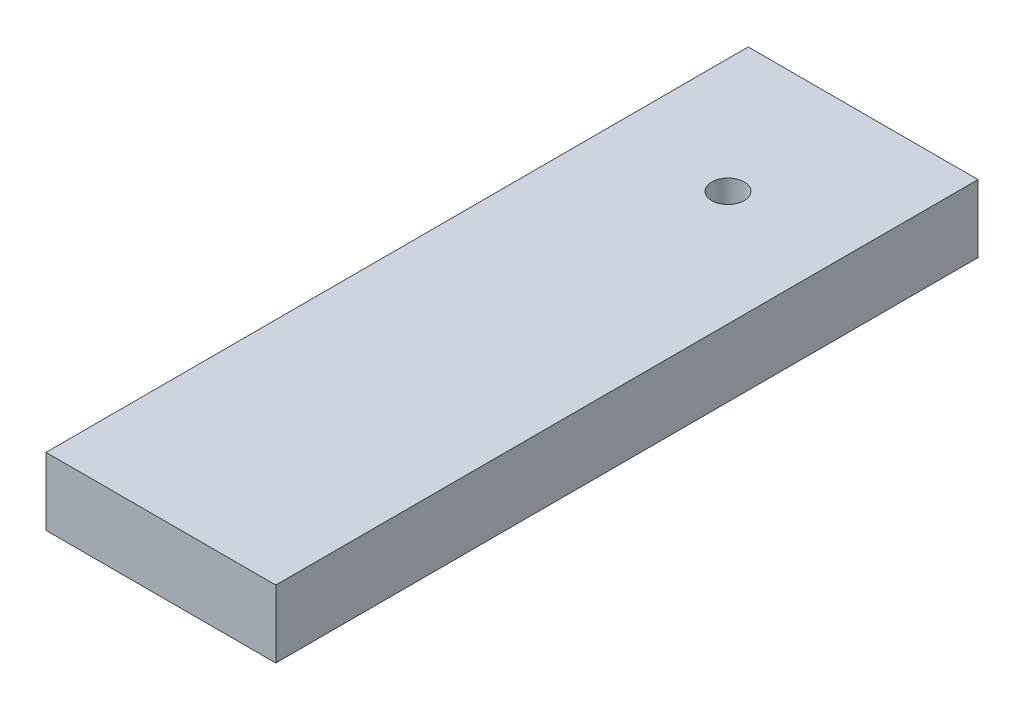
ISO-10303-21;
HEADER;
FILE_DESCRIPTION(('STEP AP214'),'2;1');
FILE_NAME('part.step','',(''),(''),'','','');
FILE_SCHEMA(('AUTOMOTIVE_DESIGN { 1 0 10303 214 1 1 1 1 }'));
ENDSEC;
DATA;
#1=APPLICATION_CONTEXT('core data for automotive mechanical design processes');
#2=APPLICATION_PROTOCOL_DEFINITION('international standard','automotive_design',2000,#1);
#3=PRODUCT_CONTEXT('',#1,'mechanical');
#4=PRODUCT('Part','Part','',(#3));
#5=PRODUCT_RELATED_PRODUCT_CATEGORY('part','',(#4));
#6=PRODUCT_DEFINITION_FORMATION('','',#4);
#7=PRODUCT_DEFINITION_CONTEXT('part definition',#1,'design');
#8=PRODUCT_DEFINITION('design','',#6,#7);
#9=PRODUCT_DEFINITION_SHAPE('','',#8);
#10=(LENGTH_UNIT() NAMED_UNIT(*) SI_UNIT(.MILLI.,.METRE.));
#11=(NAMED_UNIT(*) PLANE_ANGLE_UNIT() SI_UNIT($,.RADIAN.));
#12=(NAMED_UNIT(*) SI_UNIT($,.STERADIAN.) SOLID_ANGLE_UNIT());
#13=UNCERTAINTY_MEASURE_WITH_UNIT(LENGTH_MEASURE(1.E-05),#10,'distance_accuracy_value','');
#14=(GEOMETRIC_REPRESENTATION_CONTEXT(3) GLOBAL_UNCERTAINTY_ASSIGNED_CONTEXT((#13)) GLOBAL_UNIT_ASSIGNED_CONTEXT((#10,
#11,#12)) REPRESENTATION_CONTEXT('',''));
#15=CARTESIAN_POINT('',(0.,0.,0.));
#16=DIRECTION('',(0.,0.,1.));
#17=DIRECTION('',(1.,0.,0.));
#18=AXIS2_PLACEMENT_3D('',#15,#16,#17);
#19=CARTESIAN_POINT('',(10.795,6.35,-40.8360736696339));
#20=DIRECTION('',(-1.,0.,0.));
#21=DIRECTION('',(0.,0.,1.));
#22=AXIS2_PLACEMENT_3D('',#19,#20,#21);
#23=PLANE('',#22);
#24=DIRECTION('',(0.,0.,-1.));
#25=VECTOR('',#24,1.);
#26=CARTESIAN_POINT('',(10.795,6.35,-40.8360736696339));
#27=LINE('',#26,#25);
#28=CARTESIAN_POINT('',(10.795,6.35,25.1499686396111));
#29=VERTEX_POINT('',#28);
#30=CARTESIAN_POINT('',(10.795,6.35,-40.8360736696339));
#31=VERTEX_POINT('',#30);
#32=EDGE_CURVE('E85',#29,#31,#27,.T.);
#33=ORIENTED_EDGE('',*,*,#32,.F.);
#34=DIRECTION('',(0.,1.,0.));
#35=VECTOR('',#34,1.);
#36=CARTESIAN_POINT('',(10.795,-26.6867381111463,25.1499686396111));
#37=LINE('',#36,#35);
#38=CARTESIAN_POINT('',(10.795,0.,25.1499686396111));
#39=VERTEX_POINT('',#38);
#40=EDGE_CURVE('E93',#39,#29,#37,.T.);
#41=ORIENTED_EDGE('',*,*,#40,.F.);
#42=DIRECTION('',(0.,0.,-1.));
#43=VECTOR('',#42,1.);
#44=CARTESIAN_POINT('',(10.795,0.,-40.8360736696339));
#45=LINE('',#44,#43);
#46=CARTESIAN_POINT('',(10.795,0.,-40.8360736696339));
#47=VERTEX_POINT('',#46);
#48=EDGE_CURVE('E77',#39,#47,#45,.T.);
#49=ORIENTED_EDGE('',*,*,#48,.T.);
#50=DIRECTION('',(0.,-1.,0.));
#51=VECTOR('',#50,1.);
#52=CARTESIAN_POINT('',(10.795,6.35,-40.8360736696339));
#53=LINE('',#52,#51);
#54=EDGE_CURVE('E11',#31,#47,#53,.T.);
#55=ORIENTED_EDGE('',*,*,#54,.F.);
#56=EDGE_LOOP('',(#33,#41,#49,#55));
#57=FACE_BOUND('',#56,.T.);
#58=ADVANCED_FACE('F33',(#57),#23,.F.);
#59=CARTESIAN_POINT('',(-10.795,6.35,-40.8360736696339));
#60=DIRECTION('',(0.,0.,1.));
#61=DIRECTION('',(1.,0.,0.));
#62=AXIS2_PLACEMENT_3D('',#59,#60,#61);
#63=PLANE('',#62);
#64=DIRECTION('',(-1.,0.,0.));
#65=VECTOR('',#64,1.);
#66=CARTESIAN_POINT('',(-10.795,0.,-40.8360736696339));
#67=LINE('',#66,#65);
#68=CARTESIAN_POINT('',(-10.795,0.,-40.8360736696339));
#69=VERTEX_POINT('',#68);
#70=EDGE_CURVE('E68',#47,#69,#67,.T.);
#71=ORIENTED_EDGE('',*,*,#70,.T.);
#72=DIRECTION('',(0.,-1.,0.));
#73=VECTOR('',#72,1.);
#74=CARTESIAN_POINT('',(-10.795,6.35,-40.8360736696339));
#75=LINE('',#74,#73);
#76=CARTESIAN_POINT('',(-10.795,6.35,-40.8360736696339));
#77=VERTEX_POINT('',#76);
#78=EDGE_CURVE('E40',#77,#69,#75,.T.);
#79=ORIENTED_EDGE('',*,*,#78,.F.);
#80=DIRECTION('',(-1.,0.,0.));
#81=VECTOR('',#80,1.);
#82=CARTESIAN_POINT('',(-10.795,6.35,-40.8360736696339));
#83=LINE('',#82,#81);
#84=EDGE_CURVE('E56',#31,#77,#83,.T.);
#85=ORIENTED_EDGE('',*,*,#84,.F.);
#86=ORIENTED_EDGE('',*,*,#54,.T.);
#87=EDGE_LOOP('',(#71,#79,#85,#86));
#88=FACE_BOUND('',#87,.T.);
#89=ADVANCED_FACE('F70',(#88),#63,.F.);
#90=CARTESIAN_POINT('',(-10.795,6.35,-40.8360736696339));
#91=DIRECTION('',(1.,0.,0.));
#92=DIRECTION('',(0.,0.,-1.));
#93=AXIS2_PLACEMENT_3D('',#90,#91,#92);
#94=PLANE('',#93);
#95=DIRECTION('',(0.,0.,1.));
#96=VECTOR('',#95,1.);
#97=CARTESIAN_POINT('',(-10.795,0.,-40.8360736696339));
#98=LINE('',#97,#96);
#99=CARTESIAN_POINT('',(-10.795,0.,25.149968639611));
#100=VERTEX_POINT('',#99);
#101=EDGE_CURVE('E76',#69,#100,#98,.T.);
#102=ORIENTED_EDGE('',*,*,#101,.T.);
#103=DIRECTION('',(0.,1.,0.));
#104=VECTOR('',#103,1.);
#105=CARTESIAN_POINT('',(-10.795,-26.6867381111463,25.1499686396111));
#106=LINE('',#105,#104);
#107=CARTESIAN_POINT('',(-10.795,6.35,25.1499686396111));
#108=VERTEX_POINT('',#107);
#109=EDGE_CURVE('E47',#100,#108,#106,.T.);
#110=ORIENTED_EDGE('',*,*,#109,.T.);
#111=DIRECTION('',(0.,0.,1.));
#112=VECTOR('',#111,1.);
#113=CARTESIAN_POINT('',(-10.795,6.35,-40.8360736696339));
#114=LINE('',#113,#112);
#115=EDGE_CURVE('E82',#77,#108,#114,.T.);
#116=ORIENTED_EDGE('',*,*,#115,.F.);
#117=ORIENTED_EDGE('',*,*,#78,.T.);
#118=EDGE_LOOP('',(#102,#110,#116,#117));
#119=FACE_BOUND('',#118,.T.);
#120=ADVANCED_FACE('F81',(#119),#94,.F.);
#121=CARTESIAN_POINT('',(0.,6.35,0.));
#122=DIRECTION('',(0.,1.,0.));
#123=DIRECTION('',(0.,0.,1.));
#124=AXIS2_PLACEMENT_3D('',#121,#122,#123);
#125=PLANE('',#124);
#126=CARTESIAN_POINT('',(0.,6.35,-28.1360736696339));
#127=DIRECTION('',(0.,1.,0.));
#128=DIRECTION('',(0.,0.,1.));
#129=AXIS2_PLACEMENT_3D('',#126,#127,#128);
#130=CIRCLE('',#129,1.524);
#131=CARTESIAN_POINT('',(0.,6.35,-26.6120736696339));
#132=VERTEX_POINT('',#131);
#133=EDGE_CURVE('E102',#132,#132,#130,.T.);
#134=ORIENTED_EDGE('',*,*,#133,.F.);
#135=EDGE_LOOP('',(#134));
#136=FACE_BOUND('',#135,.T.);
#137=DIRECTION('',(-1.,0.,0.));
#138=VECTOR('',#137,1.);
#139=CARTESIAN_POINT('',(10.795,6.35,25.1499686396111));
#140=LINE('',#139,#138);
#141=EDGE_CURVE('E96',#29,#108,#140,.T.);
#142=ORIENTED_EDGE('',*,*,#141,.F.);
#143=ORIENTED_EDGE('',*,*,#32,.T.);
#144=ORIENTED_EDGE('',*,*,#84,.T.);
#145=ORIENTED_EDGE('',*,*,#115,.T.);
#146=EDGE_LOOP('',(#142,#143,#144,#145));
#147=FACE_BOUND('',#146,.T.);
#148=ADVANCED_FACE('F108',(#136,#147),#125,.T.);
#149=CARTESIAN_POINT('',(0.,0.,0.));
#150=DIRECTION('',(0.,1.,0.));
#151=DIRECTION('',(0.,0.,1.));
#152=AXIS2_PLACEMENT_3D('',#149,#150,#151);
#153=PLANE('',#152);
#154=CARTESIAN_POINT('',(0.,0.,-28.1360736696339));
#155=DIRECTION('',(0.,1.,0.));
#156=DIRECTION('',(0.,0.,1.));
#157=AXIS2_PLACEMENT_3D('',#154,#155,#156);
#158=CIRCLE('',#157,1.524);
#159=CARTESIAN_POINT('',(0.,0.,-26.6120736696339));
#160=VERTEX_POINT('',#159);
#161=EDGE_CURVE('E99',#160,#160,#158,.F.);
#162=ORIENTED_EDGE('',*,*,#161,.F.);
#163=EDGE_LOOP('',(#162));
#164=FACE_BOUND('',#163,.T.);
#165=ORIENTED_EDGE('',*,*,#48,.F.);
#166=DIRECTION('',(1.,0.,0.));
#167=VECTOR('',#166,1.);
#168=CARTESIAN_POINT('',(10.795,0.,25.1499686396111));
#169=LINE('',#168,#167);
#170=EDGE_CURVE('E84',#100,#39,#169,.T.);
#171=ORIENTED_EDGE('',*,*,#170,.F.);
#172=ORIENTED_EDGE('',*,*,#101,.F.);
#173=ORIENTED_EDGE('',*,*,#70,.F.);
#174=EDGE_LOOP('',(#165,#171,#172,#173));
#175=FACE_BOUND('',#174,.T.);
#176=ADVANCED_FACE('F83',(#164,#175),#153,.F.);
#177=CARTESIAN_POINT('',(10.795,-26.6867381111463,25.1499686396111));
#178=DIRECTION('',(0.,0.,-1.));
#179=DIRECTION('',(-1.,0.,0.));
#180=AXIS2_PLACEMENT_3D('',#177,#178,#179);
#181=PLANE('',#180);
#182=ORIENTED_EDGE('',*,*,#170,.T.);
#183=ORIENTED_EDGE('',*,*,#40,.T.);
#184=ORIENTED_EDGE('',*,*,#141,.T.);
#185=ORIENTED_EDGE('',*,*,#109,.F.);
#186=EDGE_LOOP('',(#182,#183,#184,#185));
#187=FACE_BOUND('',#186,.T.);
#188=ADVANCED_FACE('F119',(#187),#181,.F.);
#189=CARTESIAN_POINT('',(0.,-4.3105229381132,-28.1360736696339));
#190=DIRECTION('',(0.,1.,0.));
#191=DIRECTION('',(0.,0.,1.));
#192=AXIS2_PLACEMENT_3D('',#189,#190,#191);
#193=CYLINDRICAL_SURFACE('',#192,1.524);
#194=ORIENTED_EDGE('',*,*,#161,.T.);
#195=EDGE_LOOP('',(#194));
#196=FACE_BOUND('',#195,.T.);
#197=ORIENTED_EDGE('',*,*,#133,.T.);
#198=EDGE_LOOP('',(#197));
#199=FACE_BOUND('',#198,.T.);
#200=ADVANCED_FACE('F106',(#196,#199),#193,.F.);
#201=CLOSED_SHELL('',(#58,#89,#120,#148,#176,#188,#200));
#202=MANIFOLD_SOLID_BREP('B2',#201);
#203=ADVANCED_BREP_SHAPE_REPRESENTATION('',(#18,#202),#14);
#204=SHAPE_DEFINITION_REPRESENTATION(#9,#203);
ENDSEC;
END-ISO-10303-21;
